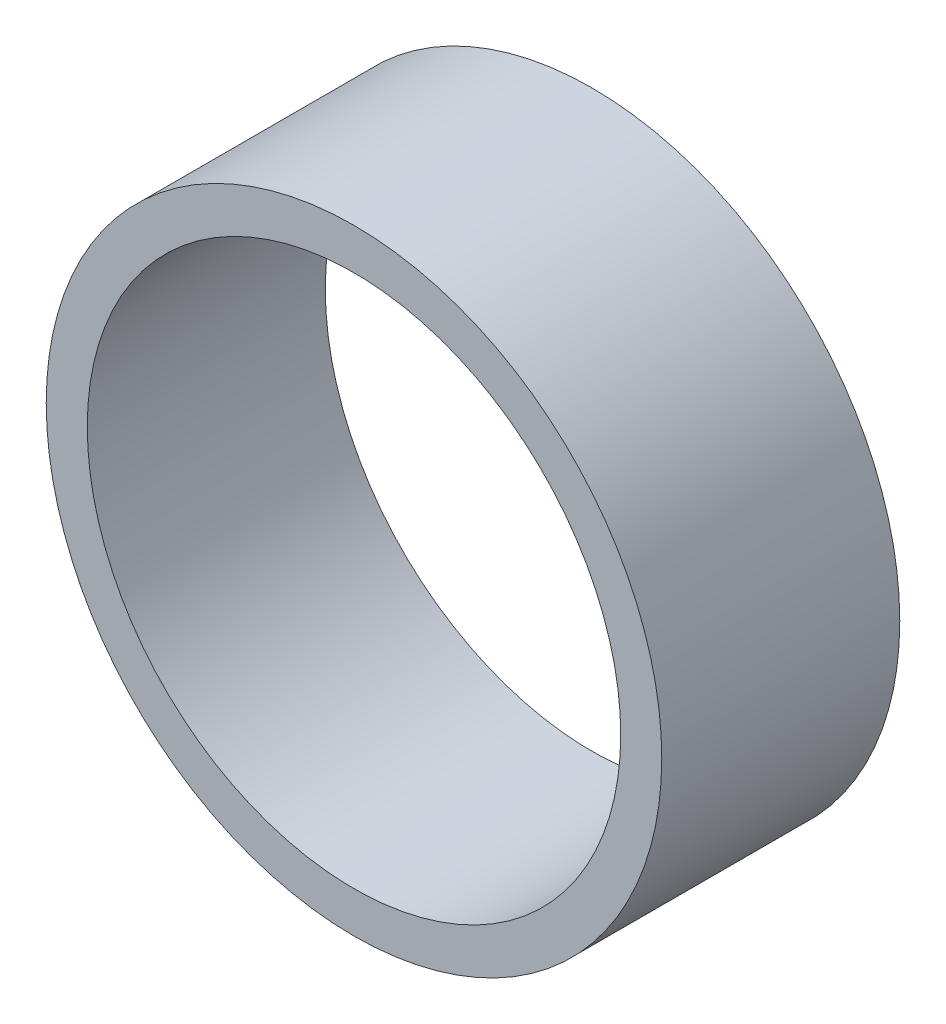
ISO-10303-21;
HEADER;
FILE_DESCRIPTION(('STEP AP214'),'2;1');
FILE_NAME('part.step','',(''),(''),'','','');
FILE_SCHEMA(('AUTOMOTIVE_DESIGN { 1 0 10303 214 1 1 1 1 }'));
ENDSEC;
DATA;
#1=APPLICATION_CONTEXT('core data for automotive mechanical design processes');
#2=APPLICATION_PROTOCOL_DEFINITION('international standard','automotive_design',2000,#1);
#3=PRODUCT_CONTEXT('',#1,'mechanical');
#4=PRODUCT('Part','Part','',(#3));
#5=PRODUCT_RELATED_PRODUCT_CATEGORY('part','',(#4));
#6=PRODUCT_DEFINITION_FORMATION('','',#4);
#7=PRODUCT_DEFINITION_CONTEXT('part definition',#1,'design');
#8=PRODUCT_DEFINITION('design','',#6,#7);
#9=PRODUCT_DEFINITION_SHAPE('','',#8);
#10=(LENGTH_UNIT() NAMED_UNIT(*) SI_UNIT(.MILLI.,.METRE.));
#11=(NAMED_UNIT(*) PLANE_ANGLE_UNIT() SI_UNIT($,.RADIAN.));
#12=(NAMED_UNIT(*) SI_UNIT($,.STERADIAN.) SOLID_ANGLE_UNIT());
#13=UNCERTAINTY_MEASURE_WITH_UNIT(LENGTH_MEASURE(1.E-05),#10,'distance_accuracy_value','');
#14=(GEOMETRIC_REPRESENTATION_CONTEXT(3) GLOBAL_UNCERTAINTY_ASSIGNED_CONTEXT((#13)) GLOBAL_UNIT_ASSIGNED_CONTEXT((#10,
#11,#12)) REPRESENTATION_CONTEXT('',''));
#15=CARTESIAN_POINT('',(0.,0.,0.));
#16=DIRECTION('',(0.,0.,1.));
#17=DIRECTION('',(1.,0.,0.));
#18=AXIS2_PLACEMENT_3D('',#15,#16,#17);
#19=CARTESIAN_POINT('',(-43.2126646474919,1.44186566085188,5.8));
#20=DIRECTION('',(0.,0.,-1.));
#21=DIRECTION('',(-1.,0.,0.));
#22=AXIS2_PLACEMENT_3D('',#19,#20,#21);
#23=CYLINDRICAL_SURFACE('',#22,7.5);
#24=CARTESIAN_POINT('',(-43.2126646474919,1.44186566085188,5.8));
#25=DIRECTION('',(0.,0.,1.));
#26=DIRECTION('',(1.,0.,0.));
#27=AXIS2_PLACEMENT_3D('',#24,#25,#26);
#28=CIRCLE('',#27,7.5);
#29=CARTESIAN_POINT('',(-35.7126646474919,1.44186566085188,5.8));
#30=VERTEX_POINT('',#29);
#31=EDGE_CURVE('E10',#30,#30,#28,.T.);
#32=ORIENTED_EDGE('',*,*,#31,.F.);
#33=EDGE_LOOP('',(#32));
#34=FACE_BOUND('',#33,.T.);
#35=CARTESIAN_POINT('',(-43.2126646474919,1.44186566085188,0.));
#36=DIRECTION('',(0.,0.,1.));
#37=DIRECTION('',(1.,0.,0.));
#38=AXIS2_PLACEMENT_3D('',#35,#36,#37);
#39=CIRCLE('',#38,7.5);
#40=CARTESIAN_POINT('',(-35.7126646474919,1.44186566085188,0.));
#41=VERTEX_POINT('',#40);
#42=EDGE_CURVE('E36',#41,#41,#39,.T.);
#43=ORIENTED_EDGE('',*,*,#42,.T.);
#44=EDGE_LOOP('',(#43));
#45=FACE_BOUND('',#44,.T.);
#46=ADVANCED_FACE('F33',(#34,#45),#23,.T.);
#47=CARTESIAN_POINT('',(-43.2126646474919,1.44186566085188,5.8));
#48=DIRECTION('',(0.,0.,1.));
#49=DIRECTION('',(1.,0.,0.));
#50=AXIS2_PLACEMENT_3D('',#47,#48,#49);
#51=PLANE('',#50);
#52=CARTESIAN_POINT('',(-43.2126646474919,1.44186566085188,5.8));
#53=DIRECTION('',(0.,0.,1.));
#54=DIRECTION('',(1.,0.,0.));
#55=AXIS2_PLACEMENT_3D('',#52,#53,#54);
#56=CIRCLE('',#55,6.5);
#57=CARTESIAN_POINT('',(-36.7126646474919,1.44186566085188,5.8));
#58=VERTEX_POINT('',#57);
#59=EDGE_CURVE('E45',#58,#58,#56,.T.);
#60=ORIENTED_EDGE('',*,*,#59,.F.);
#61=EDGE_LOOP('',(#60));
#62=FACE_BOUND('',#61,.T.);
#63=ORIENTED_EDGE('',*,*,#31,.T.);
#64=EDGE_LOOP('',(#63));
#65=FACE_BOUND('',#64,.T.);
#66=ADVANCED_FACE('F60',(#62,#65),#51,.T.);
#67=CARTESIAN_POINT('',(-43.2126646474919,1.44186566085188,0.));
#68=DIRECTION('',(0.,0.,1.));
#69=DIRECTION('',(1.,0.,0.));
#70=AXIS2_PLACEMENT_3D('',#67,#68,#69);
#71=PLANE('',#70);
#72=CARTESIAN_POINT('',(-43.2126646474919,1.44186566085188,0.));
#73=DIRECTION('',(0.,0.,1.));
#74=DIRECTION('',(1.,0.,0.));
#75=AXIS2_PLACEMENT_3D('',#72,#73,#74);
#76=CIRCLE('',#75,6.5);
#77=CARTESIAN_POINT('',(-36.7126646474919,1.44186566085188,0.));
#78=VERTEX_POINT('',#77);
#79=EDGE_CURVE('E43',#78,#78,#76,.T.);
#80=ORIENTED_EDGE('',*,*,#79,.T.);
#81=EDGE_LOOP('',(#80));
#82=FACE_BOUND('',#81,.T.);
#83=ORIENTED_EDGE('',*,*,#42,.F.);
#84=EDGE_LOOP('',(#83));
#85=FACE_BOUND('',#84,.T.);
#86=ADVANCED_FACE('F51',(#82,#85),#71,.F.);
#87=CARTESIAN_POINT('',(-43.2126646474919,1.44186566085188,0.));
#88=DIRECTION('',(0.,0.,1.));
#89=DIRECTION('',(1.,0.,0.));
#90=AXIS2_PLACEMENT_3D('',#87,#88,#89);
#91=CYLINDRICAL_SURFACE('',#90,6.5);
#92=ORIENTED_EDGE('',*,*,#79,.F.);
#93=EDGE_LOOP('',(#92));
#94=FACE_BOUND('',#93,.T.);
#95=ORIENTED_EDGE('',*,*,#59,.T.);
#96=EDGE_LOOP('',(#95));
#97=FACE_BOUND('',#96,.T.);
#98=ADVANCED_FACE('F54',(#94,#97),#91,.F.);
#99=CLOSED_SHELL('',(#46,#66,#86,#98));
#100=MANIFOLD_SOLID_BREP('B2',#99);
#101=ADVANCED_BREP_SHAPE_REPRESENTATION('',(#18,#100),#14);
#102=SHAPE_DEFINITION_REPRESENTATION(#9,#101);
ENDSEC;
END-ISO-10303-21;
